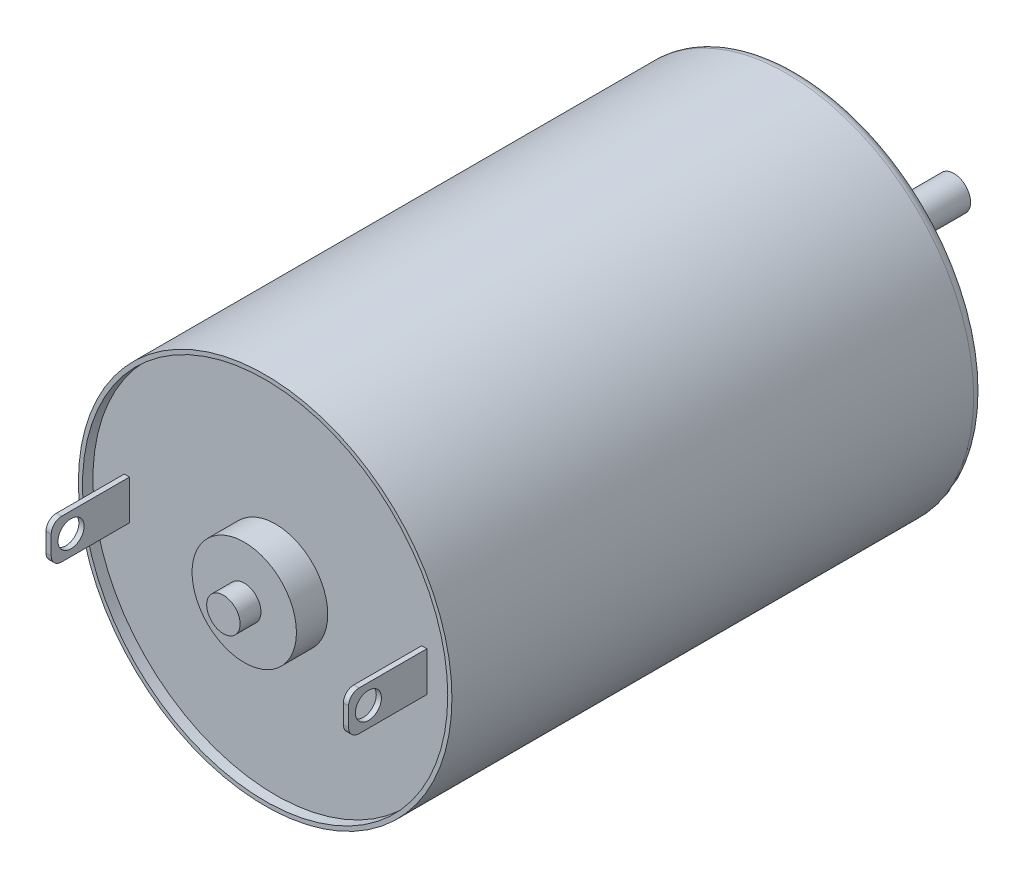
ISO-10303-21;
HEADER;
FILE_DESCRIPTION(('STEP AP214'),'2;1');
FILE_NAME('part.step','',(''),(''),'','','');
FILE_SCHEMA(('AUTOMOTIVE_DESIGN { 1 0 10303 214 1 1 1 1 }'));
ENDSEC;
DATA;
#1=APPLICATION_CONTEXT('core data for automotive mechanical design processes');
#2=APPLICATION_PROTOCOL_DEFINITION('international standard','automotive_design',2000,#1);
#3=PRODUCT_CONTEXT('',#1,'mechanical');
#4=PRODUCT('Part','Part','',(#3));
#5=PRODUCT_RELATED_PRODUCT_CATEGORY('part','',(#4));
#6=PRODUCT_DEFINITION_FORMATION('','',#4);
#7=PRODUCT_DEFINITION_CONTEXT('part definition',#1,'design');
#8=PRODUCT_DEFINITION('design','',#6,#7);
#9=PRODUCT_DEFINITION_SHAPE('','',#8);
#10=(LENGTH_UNIT() NAMED_UNIT(*) SI_UNIT(.MILLI.,.METRE.));
#11=(NAMED_UNIT(*) PLANE_ANGLE_UNIT() SI_UNIT($,.RADIAN.));
#12=(NAMED_UNIT(*) SI_UNIT($,.STERADIAN.) SOLID_ANGLE_UNIT());
#13=UNCERTAINTY_MEASURE_WITH_UNIT(LENGTH_MEASURE(1.E-05),#10,'distance_accuracy_value','');
#14=(GEOMETRIC_REPRESENTATION_CONTEXT(3) GLOBAL_UNCERTAINTY_ASSIGNED_CONTEXT((#13)) GLOBAL_UNIT_ASSIGNED_CONTEXT((#10,
#11,#12)) REPRESENTATION_CONTEXT('',''));
#15=CARTESIAN_POINT('',(0.,0.,0.));
#16=DIRECTION('',(0.,0.,1.));
#17=DIRECTION('',(1.,0.,0.));
#18=AXIS2_PLACEMENT_3D('',#15,#16,#17);
#19=CARTESIAN_POINT('',(0.,0.,50.));
#20=DIRECTION('',(0.,0.,1.));
#21=DIRECTION('',(1.,0.,0.));
#22=AXIS2_PLACEMENT_3D('',#19,#20,#21);
#23=PLANE('',#22);
#24=DIRECTION('',(0.,1.,0.));
#25=VECTOR('',#24,1.);
#26=CARTESIAN_POINT('',(14.,1.9,50.));
#27=LINE('',#26,#25);
#28=CARTESIAN_POINT('',(14.,-1.9,50.));
#29=VERTEX_POINT('',#28);
#30=CARTESIAN_POINT('',(14.,1.9,50.));
#31=VERTEX_POINT('',#30);
#32=EDGE_CURVE('E174',#29,#31,#27,.T.);
#33=ORIENTED_EDGE('',*,*,#32,.T.);
#34=DIRECTION('',(1.,0.,0.));
#35=VECTOR('',#34,1.);
#36=CARTESIAN_POINT('',(14.5,1.9,50.));
#37=LINE('',#36,#35);
#38=CARTESIAN_POINT('',(14.5,1.9,50.));
#39=VERTEX_POINT('',#38);
#40=EDGE_CURVE('E178',#31,#39,#37,.T.);
#41=ORIENTED_EDGE('',*,*,#40,.T.);
#42=DIRECTION('',(0.,-1.,0.));
#43=VECTOR('',#42,1.);
#44=CARTESIAN_POINT('',(14.5,1.9,50.));
#45=LINE('',#44,#43);
#46=CARTESIAN_POINT('',(14.5,-1.9,50.));
#47=VERTEX_POINT('',#46);
#48=EDGE_CURVE('E187',#39,#47,#45,.T.);
#49=ORIENTED_EDGE('',*,*,#48,.T.);
#50=DIRECTION('',(-1.,0.,0.));
#51=VECTOR('',#50,1.);
#52=CARTESIAN_POINT('',(14.5,-1.9,50.));
#53=LINE('',#52,#51);
#54=EDGE_CURVE('E184',#47,#29,#53,.T.);
#55=ORIENTED_EDGE('',*,*,#54,.T.);
#56=EDGE_LOOP('',(#33,#41,#49,#55));
#57=FACE_BOUND('',#56,.T.);
#58=CARTESIAN_POINT('',(0.,0.,50.));
#59=DIRECTION('',(0.,0.,1.));
#60=DIRECTION('',(1.,0.,0.));
#61=AXIS2_PLACEMENT_3D('',#58,#59,#60);
#62=CIRCLE('',#61,5.);
#63=CARTESIAN_POINT('',(5.,0.,50.));
#64=VERTEX_POINT('',#63);
#65=EDGE_CURVE('E252',#64,#64,#62,.T.);
#66=ORIENTED_EDGE('',*,*,#65,.F.);
#67=EDGE_LOOP('',(#66));
#68=FACE_BOUND('',#67,.T.);
#69=CARTESIAN_POINT('',(0.,0.,50.));
#70=DIRECTION('',(0.,0.,1.));
#71=DIRECTION('',(1.,0.,0.));
#72=AXIS2_PLACEMENT_3D('',#69,#70,#71);
#73=CIRCLE('',#72,17.5);
#74=CARTESIAN_POINT('',(17.5,0.,50.));
#75=VERTEX_POINT('',#74);
#76=EDGE_CURVE('E247',#75,#75,#73,.F.);
#77=ORIENTED_EDGE('',*,*,#76,.F.);
#78=EDGE_LOOP('',(#77));
#79=FACE_BOUND('',#78,.T.);
#80=DIRECTION('',(-1.,0.,0.));
#81=VECTOR('',#80,1.);
#82=CARTESIAN_POINT('',(-14.5,1.9,50.));
#83=LINE('',#82,#81);
#84=CARTESIAN_POINT('',(-14.,1.9,50.));
#85=VERTEX_POINT('',#84);
#86=CARTESIAN_POINT('',(-14.5,1.9,50.));
#87=VERTEX_POINT('',#86);
#88=EDGE_CURVE('E216',#85,#87,#83,.T.);
#89=ORIENTED_EDGE('',*,*,#88,.F.);
#90=DIRECTION('',(0.,1.,0.));
#91=VECTOR('',#90,1.);
#92=CARTESIAN_POINT('',(-14.,1.9,50.));
#93=LINE('',#92,#91);
#94=CARTESIAN_POINT('',(-14.,-1.9,50.));
#95=VERTEX_POINT('',#94);
#96=EDGE_CURVE('E205',#95,#85,#93,.T.);
#97=ORIENTED_EDGE('',*,*,#96,.F.);
#98=DIRECTION('',(1.,0.,0.));
#99=VECTOR('',#98,1.);
#100=CARTESIAN_POINT('',(-14.5,-1.9,50.));
#101=LINE('',#100,#99);
#102=CARTESIAN_POINT('',(-14.5,-1.9,50.));
#103=VERTEX_POINT('',#102);
#104=EDGE_CURVE('E210',#103,#95,#101,.T.);
#105=ORIENTED_EDGE('',*,*,#104,.F.);
#106=DIRECTION('',(0.,-1.,0.));
#107=VECTOR('',#106,1.);
#108=CARTESIAN_POINT('',(-14.5,1.9,50.));
#109=LINE('',#108,#107);
#110=EDGE_CURVE('E219',#87,#103,#109,.T.);
#111=ORIENTED_EDGE('',*,*,#110,.F.);
#112=EDGE_LOOP('',(#89,#97,#105,#111));
#113=FACE_BOUND('',#112,.T.);
#114=ADVANCED_FACE('F51',(#57,#68,#79,#113),#23,.T.);
#115=CARTESIAN_POINT('',(0.,0.,50.));
#116=DIRECTION('',(0.,0.,-1.));
#117=DIRECTION('',(-1.,0.,0.));
#118=AXIS2_PLACEMENT_3D('',#115,#116,#117);
#119=CYLINDRICAL_SURFACE('',#118,17.9);
#120=CARTESIAN_POINT('',(0.,0.,1.));
#121=DIRECTION('',(0.,0.,1.));
#122=DIRECTION('',(1.,0.,0.));
#123=AXIS2_PLACEMENT_3D('',#120,#121,#122);
#124=CIRCLE('',#123,17.9);
#125=CARTESIAN_POINT('',(17.9,0.,1.));
#126=VERTEX_POINT('',#125);
#127=EDGE_CURVE('E294',#126,#126,#124,.T.);
#128=ORIENTED_EDGE('',*,*,#127,.T.);
#129=EDGE_LOOP('',(#128));
#130=FACE_BOUND('',#129,.T.);
#131=CARTESIAN_POINT('',(0.,0.,51.));
#132=DIRECTION('',(0.,0.,1.));
#133=DIRECTION('',(1.,0.,0.));
#134=AXIS2_PLACEMENT_3D('',#131,#132,#133);
#135=CIRCLE('',#134,17.9);
#136=CARTESIAN_POINT('',(17.9,0.,51.));
#137=VERTEX_POINT('',#136);
#138=EDGE_CURVE('E234',#137,#137,#135,.T.);
#139=ORIENTED_EDGE('',*,*,#138,.F.);
#140=EDGE_LOOP('',(#139));
#141=FACE_BOUND('',#140,.T.);
#142=ADVANCED_FACE('F319',(#130,#141),#119,.T.);
#143=CARTESIAN_POINT('',(0.,0.,0.));
#144=DIRECTION('',(0.,0.,1.));
#145=DIRECTION('',(1.,0.,0.));
#146=AXIS2_PLACEMENT_3D('',#143,#144,#145);
#147=PLANE('',#146);
#148=CARTESIAN_POINT('',(12.5,0.,0.));
#149=DIRECTION('',(0.,0.,-1.));
#150=DIRECTION('',(-1.,0.,0.));
#151=AXIS2_PLACEMENT_3D('',#148,#149,#150);
#152=CIRCLE('',#151,1.025);
#153=CARTESIAN_POINT('',(11.475,0.,0.));
#154=VERTEX_POINT('',#153);
#155=EDGE_CURVE('E158',#154,#154,#152,.T.);
#156=ORIENTED_EDGE('',*,*,#155,.F.);
#157=EDGE_LOOP('',(#156));
#158=FACE_BOUND('',#157,.T.);
#159=CARTESIAN_POINT('',(-12.5,0.,0.));
#160=DIRECTION('',(0.,0.,-1.));
#161=DIRECTION('',(-1.,0.,0.));
#162=AXIS2_PLACEMENT_3D('',#159,#160,#161);
#163=CIRCLE('',#162,1.025);
#164=CARTESIAN_POINT('',(-13.525,0.,0.));
#165=VERTEX_POINT('',#164);
#166=EDGE_CURVE('E157',#165,#165,#163,.T.);
#167=ORIENTED_EDGE('',*,*,#166,.F.);
#168=EDGE_LOOP('',(#167));
#169=FACE_BOUND('',#168,.T.);
#170=CARTESIAN_POINT('',(0.,0.,0.));
#171=DIRECTION('',(0.,0.,1.));
#172=DIRECTION('',(1.,0.,0.));
#173=AXIS2_PLACEMENT_3D('',#170,#171,#172);
#174=CIRCLE('',#173,16.9);
#175=CARTESIAN_POINT('',(16.9,0.,0.));
#176=VERTEX_POINT('',#175);
#177=EDGE_CURVE('E297',#176,#176,#174,.F.);
#178=ORIENTED_EDGE('',*,*,#177,.T.);
#179=EDGE_LOOP('',(#178));
#180=FACE_BOUND('',#179,.T.);
#181=CARTESIAN_POINT('',(0.,0.,0.));
#182=DIRECTION('',(0.,0.,-1.));
#183=DIRECTION('',(-1.,0.,0.));
#184=AXIS2_PLACEMENT_3D('',#181,#182,#183);
#185=CIRCLE('',#184,6.5);
#186=CARTESIAN_POINT('',(-6.5,0.,0.));
#187=VERTEX_POINT('',#186);
#188=EDGE_CURVE('E251',#187,#187,#185,.T.);
#189=ORIENTED_EDGE('',*,*,#188,.F.);
#190=EDGE_LOOP('',(#189));
#191=FACE_BOUND('',#190,.T.);
#192=ADVANCED_FACE('F325',(#158,#169,#180,#191),#147,.F.);
#193=CARTESIAN_POINT('',(0.,0.,-4.));
#194=DIRECTION('',(0.,0.,1.));
#195=DIRECTION('',(1.,0.,0.));
#196=AXIS2_PLACEMENT_3D('',#193,#194,#195);
#197=CYLINDRICAL_SURFACE('',#196,6.5);
#198=CARTESIAN_POINT('',(0.,0.,-3.));
#199=DIRECTION('',(0.,0.,-1.));
#200=DIRECTION('',(-1.,0.,0.));
#201=AXIS2_PLACEMENT_3D('',#198,#199,#200);
#202=CIRCLE('',#201,6.5);
#203=CARTESIAN_POINT('',(-6.5,0.,-3.));
#204=VERTEX_POINT('',#203);
#205=EDGE_CURVE('E12',#204,#204,#202,.F.);
#206=ORIENTED_EDGE('',*,*,#205,.T.);
#207=EDGE_LOOP('',(#206));
#208=FACE_BOUND('',#207,.T.);
#209=ORIENTED_EDGE('',*,*,#188,.T.);
#210=EDGE_LOOP('',(#209));
#211=FACE_BOUND('',#210,.T.);
#212=ADVANCED_FACE('F331',(#208,#211),#197,.T.);
#213=CARTESIAN_POINT('',(0.,0.,-4.));
#214=DIRECTION('',(0.,0.,-1.));
#215=DIRECTION('',(-1.,0.,0.));
#216=AXIS2_PLACEMENT_3D('',#213,#214,#215);
#217=PLANE('',#216);
#218=CARTESIAN_POINT('',(0.,0.,-4.));
#219=DIRECTION('',(0.,0.,-1.));
#220=DIRECTION('',(-1.,0.,0.));
#221=AXIS2_PLACEMENT_3D('',#218,#219,#220);
#222=CIRCLE('',#221,5.5);
#223=CARTESIAN_POINT('',(-5.5,0.,-4.));
#224=VERTEX_POINT('',#223);
#225=EDGE_CURVE('E59',#224,#224,#222,.T.);
#226=ORIENTED_EDGE('',*,*,#225,.T.);
#227=EDGE_LOOP('',(#226));
#228=FACE_BOUND('',#227,.T.);
#229=CARTESIAN_POINT('',(0.,0.,-4.));
#230=DIRECTION('',(0.,0.,-1.));
#231=DIRECTION('',(-1.,0.,0.));
#232=AXIS2_PLACEMENT_3D('',#229,#230,#231);
#233=CIRCLE('',#232,1.6);
#234=CARTESIAN_POINT('',(-1.6,0.,-4.));
#235=VERTEX_POINT('',#234);
#236=EDGE_CURVE('E244',#235,#235,#233,.T.);
#237=ORIENTED_EDGE('',*,*,#236,.F.);
#238=EDGE_LOOP('',(#237));
#239=FACE_BOUND('',#238,.T.);
#240=ADVANCED_FACE('F302',(#228,#239),#217,.T.);
#241=CARTESIAN_POINT('',(0.,0.,61.5254833995939));
#242=DIRECTION('',(0.,0.,-1.));
#243=DIRECTION('',(-1.,0.,0.));
#244=AXIS2_PLACEMENT_3D('',#241,#242,#243);
#245=CYLINDRICAL_SURFACE('',#244,1.6);
#246=ORIENTED_EDGE('',*,*,#236,.T.);
#247=EDGE_LOOP('',(#246));
#248=FACE_BOUND('',#247,.T.);
#249=CARTESIAN_POINT('',(0.,0.,-15.));
#250=DIRECTION('',(0.,0.,-1.));
#251=DIRECTION('',(-1.,0.,0.));
#252=AXIS2_PLACEMENT_3D('',#249,#250,#251);
#253=CIRCLE('',#252,1.6);
#254=CARTESIAN_POINT('',(-1.6,0.,-15.));
#255=VERTEX_POINT('',#254);
#256=EDGE_CURVE('E237',#255,#255,#253,.T.);
#257=ORIENTED_EDGE('',*,*,#256,.F.);
#258=EDGE_LOOP('',(#257));
#259=FACE_BOUND('',#258,.T.);
#260=ADVANCED_FACE('F427',(#248,#259),#245,.T.);
#261=CARTESIAN_POINT('',(0.,0.,-15.));
#262=DIRECTION('',(0.,0.,-1.));
#263=DIRECTION('',(-1.,0.,0.));
#264=AXIS2_PLACEMENT_3D('',#261,#262,#263);
#265=PLANE('',#264);
#266=ORIENTED_EDGE('',*,*,#256,.T.);
#267=EDGE_LOOP('',(#266));
#268=FACE_BOUND('',#267,.T.);
#269=ADVANCED_FACE('F423',(#268),#265,.T.);
#270=CARTESIAN_POINT('',(0.,0.,51.));
#271=DIRECTION('',(0.,0.,1.));
#272=DIRECTION('',(1.,0.,0.));
#273=AXIS2_PLACEMENT_3D('',#270,#271,#272);
#274=PLANE('',#273);
#275=ORIENTED_EDGE('',*,*,#138,.T.);
#276=EDGE_LOOP('',(#275));
#277=FACE_BOUND('',#276,.T.);
#278=CARTESIAN_POINT('',(0.,0.,51.));
#279=DIRECTION('',(0.,0.,1.));
#280=DIRECTION('',(1.,0.,0.));
#281=AXIS2_PLACEMENT_3D('',#278,#279,#280);
#282=CIRCLE('',#281,17.5);
#283=CARTESIAN_POINT('',(17.5,0.,51.));
#284=VERTEX_POINT('',#283);
#285=EDGE_CURVE('E231',#284,#284,#282,.T.);
#286=ORIENTED_EDGE('',*,*,#285,.F.);
#287=EDGE_LOOP('',(#286));
#288=FACE_BOUND('',#287,.T.);
#289=ADVANCED_FACE('F419',(#277,#288),#274,.T.);
#290=CARTESIAN_POINT('',(0.,0.,51.));
#291=DIRECTION('',(0.,0.,-1.));
#292=DIRECTION('',(-1.,0.,0.));
#293=AXIS2_PLACEMENT_3D('',#290,#291,#292);
#294=CYLINDRICAL_SURFACE('',#293,17.5);
#295=ORIENTED_EDGE('',*,*,#285,.T.);
#296=EDGE_LOOP('',(#295));
#297=FACE_BOUND('',#296,.T.);
#298=ORIENTED_EDGE('',*,*,#76,.T.);
#299=EDGE_LOOP('',(#298));
#300=FACE_BOUND('',#299,.T.);
#301=ADVANCED_FACE('F415',(#297,#300),#294,.F.);
#302=CARTESIAN_POINT('',(0.,0.,55.));
#303=DIRECTION('',(0.,0.,1.));
#304=DIRECTION('',(1.,0.,0.));
#305=AXIS2_PLACEMENT_3D('',#302,#303,#304);
#306=PLANE('',#305);
#307=CARTESIAN_POINT('',(0.,0.,55.));
#308=DIRECTION('',(0.,0.,1.));
#309=DIRECTION('',(1.,0.,0.));
#310=AXIS2_PLACEMENT_3D('',#307,#308,#309);
#311=CIRCLE('',#310,1.6);
#312=CARTESIAN_POINT('',(1.6,0.,55.));
#313=VERTEX_POINT('',#312);
#314=EDGE_CURVE('E240',#313,#313,#311,.F.);
#315=ORIENTED_EDGE('',*,*,#314,.F.);
#316=EDGE_LOOP('',(#315));
#317=FACE_BOUND('',#316,.T.);
#318=ADVANCED_FACE('F418',(#317),#306,.T.);
#319=CARTESIAN_POINT('',(0.,0.,53.));
#320=DIRECTION('',(0.,0.,1.));
#321=DIRECTION('',(1.,0.,0.));
#322=AXIS2_PLACEMENT_3D('',#319,#320,#321);
#323=CIRCLE('',#322,1.6);
#324=CARTESIAN_POINT('',(1.6,0.,53.));
#325=VERTEX_POINT('',#324);
#326=EDGE_CURVE('E248',#325,#325,#323,.T.);
#327=ORIENTED_EDGE('',*,*,#326,.T.);
#328=EDGE_LOOP('',(#327));
#329=FACE_BOUND('',#328,.T.);
#330=ORIENTED_EDGE('',*,*,#314,.T.);
#331=EDGE_LOOP('',(#330));
#332=FACE_BOUND('',#331,.T.);
#333=ADVANCED_FACE('F429',(#329,#332),#245,.T.);
#334=CARTESIAN_POINT('',(0.,0.,53.));
#335=DIRECTION('',(0.,0.,1.));
#336=DIRECTION('',(1.,0.,0.));
#337=AXIS2_PLACEMENT_3D('',#334,#335,#336);
#338=PLANE('',#337);
#339=ORIENTED_EDGE('',*,*,#326,.F.);
#340=EDGE_LOOP('',(#339));
#341=FACE_BOUND('',#340,.T.);
#342=CARTESIAN_POINT('',(0.,0.,53.));
#343=DIRECTION('',(0.,0.,1.));
#344=DIRECTION('',(1.,0.,0.));
#345=AXIS2_PLACEMENT_3D('',#342,#343,#344);
#346=CIRCLE('',#345,5.);
#347=CARTESIAN_POINT('',(5.,0.,53.));
#348=VERTEX_POINT('',#347);
#349=EDGE_CURVE('E243',#348,#348,#346,.T.);
#350=ORIENTED_EDGE('',*,*,#349,.T.);
#351=EDGE_LOOP('',(#350));
#352=FACE_BOUND('',#351,.T.);
#353=ADVANCED_FACE('F432',(#341,#352),#338,.T.);
#354=CARTESIAN_POINT('',(0.,0.,53.));
#355=DIRECTION('',(0.,0.,-1.));
#356=DIRECTION('',(-1.,0.,0.));
#357=AXIS2_PLACEMENT_3D('',#354,#355,#356);
#358=CYLINDRICAL_SURFACE('',#357,5.);
#359=ORIENTED_EDGE('',*,*,#349,.F.);
#360=EDGE_LOOP('',(#359));
#361=FACE_BOUND('',#360,.T.);
#362=ORIENTED_EDGE('',*,*,#65,.T.);
#363=EDGE_LOOP('',(#362));
#364=FACE_BOUND('',#363,.T.);
#365=ADVANCED_FACE('F413',(#361,#364),#358,.T.);
#366=CARTESIAN_POINT('',(-14.,1.9,57.5));
#367=DIRECTION('',(-1.,0.,0.));
#368=DIRECTION('',(0.,0.,1.));
#369=AXIS2_PLACEMENT_3D('',#366,#367,#368);
#370=PLANE('',#369);
#371=CARTESIAN_POINT('',(-14.,0.,55.6));
#372=DIRECTION('',(-1.,0.,0.));
#373=DIRECTION('',(0.,0.,1.));
#374=AXIS2_PLACEMENT_3D('',#371,#372,#373);
#375=CIRCLE('',#374,1.25);
#376=CARTESIAN_POINT('',(-14.,0.,56.85));
#377=VERTEX_POINT('',#376);
#378=EDGE_CURVE('E202',#377,#377,#375,.F.);
#379=ORIENTED_EDGE('',*,*,#378,.F.);
#380=EDGE_LOOP('',(#379));
#381=FACE_BOUND('',#380,.T.);
#382=DIRECTION('',(0.,0.,-1.));
#383=VECTOR('',#382,1.);
#384=CARTESIAN_POINT('',(-14.,1.9,57.5));
#385=LINE('',#384,#383);
#386=CARTESIAN_POINT('',(-14.,1.9,56.5));
#387=VERTEX_POINT('',#386);
#388=EDGE_CURVE('E229',#387,#85,#385,.T.);
#389=ORIENTED_EDGE('',*,*,#388,.F.);
#390=CARTESIAN_POINT('',(-14.,0.9,56.5));
#391=DIRECTION('',(-1.,0.,0.));
#392=DIRECTION('',(0.,0.,1.));
#393=AXIS2_PLACEMENT_3D('',#390,#391,#392);
#394=CIRCLE('',#393,1.);
#395=CARTESIAN_POINT('',(-14.,0.9,57.5));
#396=VERTEX_POINT('',#395);
#397=EDGE_CURVE('E275',#387,#396,#394,.F.);
#398=ORIENTED_EDGE('',*,*,#397,.T.);
#399=DIRECTION('',(0.,1.,0.));
#400=VECTOR('',#399,1.);
#401=CARTESIAN_POINT('',(-14.,1.9,57.5));
#402=LINE('',#401,#400);
#403=CARTESIAN_POINT('',(-14.,-0.899999999999999,57.5));
#404=VERTEX_POINT('',#403);
#405=EDGE_CURVE('E206',#404,#396,#402,.T.);
#406=ORIENTED_EDGE('',*,*,#405,.F.);
#407=CARTESIAN_POINT('',(-14.,-0.9,56.5));
#408=DIRECTION('',(-1.,0.,0.));
#409=DIRECTION('',(0.,0.,1.));
#410=AXIS2_PLACEMENT_3D('',#407,#408,#409);
#411=CIRCLE('',#410,1.);
#412=CARTESIAN_POINT('',(-14.,-1.9,56.5));
#413=VERTEX_POINT('',#412);
#414=EDGE_CURVE('E273',#404,#413,#411,.F.);
#415=ORIENTED_EDGE('',*,*,#414,.T.);
#416=DIRECTION('',(0.,0.,-1.));
#417=VECTOR('',#416,1.);
#418=CARTESIAN_POINT('',(-14.,-1.9,57.5));
#419=LINE('',#418,#417);
#420=EDGE_CURVE('E213',#413,#95,#419,.T.);
#421=ORIENTED_EDGE('',*,*,#420,.T.);
#422=ORIENTED_EDGE('',*,*,#96,.T.);
#423=EDGE_LOOP('',(#389,#398,#406,#415,#421,#422));
#424=FACE_BOUND('',#423,.T.);
#425=ADVANCED_FACE('F409',(#381,#424),#370,.F.);
#426=CARTESIAN_POINT('',(-14.5,1.9,57.5));
#427=DIRECTION('',(0.,-1.,0.));
#428=DIRECTION('',(0.,0.,-1.));
#429=AXIS2_PLACEMENT_3D('',#426,#427,#428);
#430=PLANE('',#429);
#431=DIRECTION('',(0.,0.,-1.));
#432=VECTOR('',#431,1.);
#433=CARTESIAN_POINT('',(-14.5,1.9,57.5));
#434=LINE('',#433,#432);
#435=CARTESIAN_POINT('',(-14.5,1.9,56.5));
#436=VERTEX_POINT('',#435);
#437=EDGE_CURVE('E227',#436,#87,#434,.T.);
#438=ORIENTED_EDGE('',*,*,#437,.F.);
#439=DIRECTION('',(-1.,0.,0.));
#440=VECTOR('',#439,1.);
#441=CARTESIAN_POINT('',(-14.,1.9,56.5));
#442=LINE('',#441,#440);
#443=EDGE_CURVE('E271',#436,#387,#442,.F.);
#444=ORIENTED_EDGE('',*,*,#443,.T.);
#445=ORIENTED_EDGE('',*,*,#388,.T.);
#446=ORIENTED_EDGE('',*,*,#88,.T.);
#447=EDGE_LOOP('',(#438,#444,#445,#446));
#448=FACE_BOUND('',#447,.T.);
#449=ADVANCED_FACE('F405',(#448),#430,.F.);
#450=CARTESIAN_POINT('',(-14.5,1.9,57.5));
#451=DIRECTION('',(1.,0.,0.));
#452=DIRECTION('',(0.,0.,-1.));
#453=AXIS2_PLACEMENT_3D('',#450,#451,#452);
#454=PLANE('',#453);
#455=CARTESIAN_POINT('',(-14.5,0.,55.6));
#456=DIRECTION('',(-1.,0.,0.));
#457=DIRECTION('',(0.,0.,1.));
#458=AXIS2_PLACEMENT_3D('',#455,#456,#457);
#459=CIRCLE('',#458,1.25);
#460=CARTESIAN_POINT('',(-14.5,0.,56.85));
#461=VERTEX_POINT('',#460);
#462=EDGE_CURVE('E199',#461,#461,#459,.T.);
#463=ORIENTED_EDGE('',*,*,#462,.F.);
#464=EDGE_LOOP('',(#463));
#465=FACE_BOUND('',#464,.T.);
#466=DIRECTION('',(0.,-1.,0.));
#467=VECTOR('',#466,1.);
#468=CARTESIAN_POINT('',(-14.5,1.9,57.5));
#469=LINE('',#468,#467);
#470=CARTESIAN_POINT('',(-14.5,0.9,57.5));
#471=VERTEX_POINT('',#470);
#472=CARTESIAN_POINT('',(-14.5,-0.899999999999999,57.5));
#473=VERTEX_POINT('',#472);
#474=EDGE_CURVE('E209',#471,#473,#469,.T.);
#475=ORIENTED_EDGE('',*,*,#474,.F.);
#476=CARTESIAN_POINT('',(-14.5,0.9,56.5));
#477=DIRECTION('',(1.,0.,0.));
#478=DIRECTION('',(0.,0.,-1.));
#479=AXIS2_PLACEMENT_3D('',#476,#477,#478);
#480=CIRCLE('',#479,1.);
#481=EDGE_CURVE('E269',#471,#436,#480,.F.);
#482=ORIENTED_EDGE('',*,*,#481,.T.);
#483=ORIENTED_EDGE('',*,*,#437,.T.);
#484=ORIENTED_EDGE('',*,*,#110,.T.);
#485=DIRECTION('',(0.,0.,-1.));
#486=VECTOR('',#485,1.);
#487=CARTESIAN_POINT('',(-14.5,-1.9,57.5));
#488=LINE('',#487,#486);
#489=CARTESIAN_POINT('',(-14.5,-1.9,56.5));
#490=VERTEX_POINT('',#489);
#491=EDGE_CURVE('E225',#490,#103,#488,.T.);
#492=ORIENTED_EDGE('',*,*,#491,.F.);
#493=CARTESIAN_POINT('',(-14.5,-0.9,56.5));
#494=DIRECTION('',(1.,0.,0.));
#495=DIRECTION('',(0.,0.,-1.));
#496=AXIS2_PLACEMENT_3D('',#493,#494,#495);
#497=CIRCLE('',#496,1.);
#498=EDGE_CURVE('E267',#490,#473,#497,.F.);
#499=ORIENTED_EDGE('',*,*,#498,.T.);
#500=EDGE_LOOP('',(#475,#482,#483,#484,#492,#499));
#501=FACE_BOUND('',#500,.T.);
#502=ADVANCED_FACE('F401',(#465,#501),#454,.F.);
#503=CARTESIAN_POINT('',(-14.5,-1.9,57.5));
#504=DIRECTION('',(0.,1.,0.));
#505=DIRECTION('',(0.,0.,1.));
#506=AXIS2_PLACEMENT_3D('',#503,#504,#505);
#507=PLANE('',#506);
#508=ORIENTED_EDGE('',*,*,#420,.F.);
#509=DIRECTION('',(1.,0.,0.));
#510=VECTOR('',#509,1.);
#511=CARTESIAN_POINT('',(-14.5,-1.9,56.5));
#512=LINE('',#511,#510);
#513=EDGE_CURVE('E277',#413,#490,#512,.F.);
#514=ORIENTED_EDGE('',*,*,#513,.T.);
#515=ORIENTED_EDGE('',*,*,#491,.T.);
#516=ORIENTED_EDGE('',*,*,#104,.T.);
#517=EDGE_LOOP('',(#508,#514,#515,#516));
#518=FACE_BOUND('',#517,.T.);
#519=ADVANCED_FACE('F397',(#518),#507,.F.);
#520=CARTESIAN_POINT('',(0.,0.,57.5));
#521=DIRECTION('',(0.,0.,1.));
#522=DIRECTION('',(1.,0.,0.));
#523=AXIS2_PLACEMENT_3D('',#520,#521,#522);
#524=PLANE('',#523);
#525=ORIENTED_EDGE('',*,*,#405,.T.);
#526=DIRECTION('',(-1.,0.,0.));
#527=VECTOR('',#526,1.);
#528=CARTESIAN_POINT('',(-14.5,0.9,57.5));
#529=LINE('',#528,#527);
#530=EDGE_CURVE('E264',#396,#471,#529,.T.);
#531=ORIENTED_EDGE('',*,*,#530,.T.);
#532=ORIENTED_EDGE('',*,*,#474,.T.);
#533=DIRECTION('',(1.,0.,0.));
#534=VECTOR('',#533,1.);
#535=CARTESIAN_POINT('',(-14.,-0.9,57.5));
#536=LINE('',#535,#534);
#537=EDGE_CURVE('E261',#473,#404,#536,.T.);
#538=ORIENTED_EDGE('',*,*,#537,.T.);
#539=EDGE_LOOP('',(#525,#531,#532,#538));
#540=FACE_BOUND('',#539,.T.);
#541=ADVANCED_FACE('F393',(#540),#524,.T.);
#542=CARTESIAN_POINT('',(-10.4644660940673,0.,55.6));
#543=DIRECTION('',(-1.,0.,0.));
#544=DIRECTION('',(0.,0.,1.));
#545=AXIS2_PLACEMENT_3D('',#542,#543,#544);
#546=CYLINDRICAL_SURFACE('',#545,1.25);
#547=ORIENTED_EDGE('',*,*,#378,.T.);
#548=EDGE_LOOP('',(#547));
#549=FACE_BOUND('',#548,.T.);
#550=ORIENTED_EDGE('',*,*,#462,.T.);
#551=EDGE_LOOP('',(#550));
#552=FACE_BOUND('',#551,.T.);
#553=ADVANCED_FACE('F340',(#549,#552),#546,.F.);
#554=CARTESIAN_POINT('',(0.,0.9,56.5));
#555=DIRECTION('',(1.,0.,0.));
#556=DIRECTION('',(0.,0.,-1.));
#557=AXIS2_PLACEMENT_3D('',#554,#555,#556);
#558=CYLINDRICAL_SURFACE('',#557,1.);
#559=ORIENTED_EDGE('',*,*,#397,.F.);
#560=ORIENTED_EDGE('',*,*,#443,.F.);
#561=ORIENTED_EDGE('',*,*,#481,.F.);
#562=ORIENTED_EDGE('',*,*,#530,.F.);
#563=EDGE_LOOP('',(#559,#560,#561,#562));
#564=FACE_BOUND('',#563,.T.);
#565=ADVANCED_FACE('F336',(#564),#558,.T.);
#566=CARTESIAN_POINT('',(0.,-0.9,56.5));
#567=DIRECTION('',(-1.,0.,0.));
#568=DIRECTION('',(0.,0.,1.));
#569=AXIS2_PLACEMENT_3D('',#566,#567,#568);
#570=CYLINDRICAL_SURFACE('',#569,1.);
#571=ORIENTED_EDGE('',*,*,#498,.F.);
#572=ORIENTED_EDGE('',*,*,#513,.F.);
#573=ORIENTED_EDGE('',*,*,#414,.F.);
#574=ORIENTED_EDGE('',*,*,#537,.F.);
#575=EDGE_LOOP('',(#571,#572,#573,#574));
#576=FACE_BOUND('',#575,.T.);
#577=ADVANCED_FACE('F339',(#576),#570,.T.);
#578=CARTESIAN_POINT('',(14.,1.9,57.5));
#579=DIRECTION('',(-1.,0.,0.));
#580=DIRECTION('',(0.,0.,1.));
#581=AXIS2_PLACEMENT_3D('',#578,#579,#580);
#582=PLANE('',#581);
#583=CARTESIAN_POINT('',(14.,0.,55.6));
#584=DIRECTION('',(1.,0.,0.));
#585=DIRECTION('',(0.,0.,-1.));
#586=AXIS2_PLACEMENT_3D('',#583,#584,#585);
#587=CIRCLE('',#586,1.25);
#588=CARTESIAN_POINT('',(14.,0.,54.35));
#589=VERTEX_POINT('',#588);
#590=EDGE_CURVE('E171',#589,#589,#587,.T.);
#591=ORIENTED_EDGE('',*,*,#590,.T.);
#592=EDGE_LOOP('',(#591));
#593=FACE_BOUND('',#592,.T.);
#594=DIRECTION('',(0.,1.,0.));
#595=VECTOR('',#594,1.);
#596=CARTESIAN_POINT('',(14.,1.9,57.5));
#597=LINE('',#596,#595);
#598=CARTESIAN_POINT('',(14.,-0.899999999999999,57.5));
#599=VERTEX_POINT('',#598);
#600=CARTESIAN_POINT('',(14.,0.9,57.5));
#601=VERTEX_POINT('',#600);
#602=EDGE_CURVE('E175',#599,#601,#597,.T.);
#603=ORIENTED_EDGE('',*,*,#602,.T.);
#604=CARTESIAN_POINT('',(14.,0.9,56.5));
#605=DIRECTION('',(-1.,0.,0.));
#606=DIRECTION('',(0.,0.,1.));
#607=AXIS2_PLACEMENT_3D('',#604,#605,#606);
#608=CIRCLE('',#607,1.);
#609=CARTESIAN_POINT('',(14.,1.9,56.5));
#610=VERTEX_POINT('',#609);
#611=EDGE_CURVE('E290',#601,#610,#608,.T.);
#612=ORIENTED_EDGE('',*,*,#611,.T.);
#613=DIRECTION('',(0.,0.,-1.));
#614=VECTOR('',#613,1.);
#615=CARTESIAN_POINT('',(14.,1.9,57.5));
#616=LINE('',#615,#614);
#617=EDGE_CURVE('E181',#610,#31,#616,.T.);
#618=ORIENTED_EDGE('',*,*,#617,.T.);
#619=ORIENTED_EDGE('',*,*,#32,.F.);
#620=DIRECTION('',(0.,0.,-1.));
#621=VECTOR('',#620,1.);
#622=CARTESIAN_POINT('',(14.,-1.9,57.5));
#623=LINE('',#622,#621);
#624=CARTESIAN_POINT('',(14.,-1.9,56.5));
#625=VERTEX_POINT('',#624);
#626=EDGE_CURVE('E197',#625,#29,#623,.T.);
#627=ORIENTED_EDGE('',*,*,#626,.F.);
#628=CARTESIAN_POINT('',(14.,-0.9,56.5));
#629=DIRECTION('',(-1.,0.,0.));
#630=DIRECTION('',(0.,0.,1.));
#631=AXIS2_PLACEMENT_3D('',#628,#629,#630);
#632=CIRCLE('',#631,1.);
#633=EDGE_CURVE('E66',#625,#599,#632,.T.);
#634=ORIENTED_EDGE('',*,*,#633,.T.);
#635=EDGE_LOOP('',(#603,#612,#618,#619,#627,#634));
#636=FACE_BOUND('',#635,.T.);
#637=ADVANCED_FACE('F344',(#593,#636),#582,.T.);
#638=CARTESIAN_POINT('',(14.5,-1.9,57.5));
#639=DIRECTION('',(0.,-1.,0.));
#640=DIRECTION('',(0.,0.,-1.));
#641=AXIS2_PLACEMENT_3D('',#638,#639,#640);
#642=PLANE('',#641);
#643=DIRECTION('',(0.,0.,-1.));
#644=VECTOR('',#643,1.);
#645=CARTESIAN_POINT('',(14.5,-1.9,57.5));
#646=LINE('',#645,#644);
#647=CARTESIAN_POINT('',(14.5,-1.9,56.5));
#648=VERTEX_POINT('',#647);
#649=EDGE_CURVE('E195',#648,#47,#646,.T.);
#650=ORIENTED_EDGE('',*,*,#649,.F.);
#651=DIRECTION('',(-1.,0.,0.));
#652=VECTOR('',#651,1.);
#653=CARTESIAN_POINT('',(14.5,-1.9,56.5));
#654=LINE('',#653,#652);
#655=EDGE_CURVE('E292',#648,#625,#654,.T.);
#656=ORIENTED_EDGE('',*,*,#655,.T.);
#657=ORIENTED_EDGE('',*,*,#626,.T.);
#658=ORIENTED_EDGE('',*,*,#54,.F.);
#659=EDGE_LOOP('',(#650,#656,#657,#658));
#660=FACE_BOUND('',#659,.T.);
#661=ADVANCED_FACE('F362',(#660),#642,.T.);
#662=CARTESIAN_POINT('',(14.5,1.9,57.5));
#663=DIRECTION('',(1.,0.,0.));
#664=DIRECTION('',(0.,0.,-1.));
#665=AXIS2_PLACEMENT_3D('',#662,#663,#664);
#666=PLANE('',#665);
#667=CARTESIAN_POINT('',(14.5,0.,55.6));
#668=DIRECTION('',(-1.,0.,0.));
#669=DIRECTION('',(0.,0.,1.));
#670=AXIS2_PLACEMENT_3D('',#667,#668,#669);
#671=CIRCLE('',#670,1.25);
#672=CARTESIAN_POINT('',(14.5,0.,56.85));
#673=VERTEX_POINT('',#672);
#674=EDGE_CURVE('E168',#673,#673,#671,.T.);
#675=ORIENTED_EDGE('',*,*,#674,.T.);
#676=EDGE_LOOP('',(#675));
#677=FACE_BOUND('',#676,.T.);
#678=DIRECTION('',(0.,0.,-1.));
#679=VECTOR('',#678,1.);
#680=CARTESIAN_POINT('',(14.5,1.9,57.5));
#681=LINE('',#680,#679);
#682=CARTESIAN_POINT('',(14.5,1.9,56.5));
#683=VERTEX_POINT('',#682);
#684=EDGE_CURVE('E193',#683,#39,#681,.T.);
#685=ORIENTED_EDGE('',*,*,#684,.F.);
#686=CARTESIAN_POINT('',(14.5,0.9,56.5));
#687=DIRECTION('',(1.,0.,0.));
#688=DIRECTION('',(0.,0.,-1.));
#689=AXIS2_PLACEMENT_3D('',#686,#687,#688);
#690=CIRCLE('',#689,1.);
#691=CARTESIAN_POINT('',(14.5,0.9,57.5));
#692=VERTEX_POINT('',#691);
#693=EDGE_CURVE('E284',#683,#692,#690,.T.);
#694=ORIENTED_EDGE('',*,*,#693,.T.);
#695=DIRECTION('',(0.,-1.,0.));
#696=VECTOR('',#695,1.);
#697=CARTESIAN_POINT('',(14.5,1.9,57.5));
#698=LINE('',#697,#696);
#699=CARTESIAN_POINT('',(14.5,-0.899999999999999,57.5));
#700=VERTEX_POINT('',#699);
#701=EDGE_CURVE('E177',#692,#700,#698,.T.);
#702=ORIENTED_EDGE('',*,*,#701,.T.);
#703=CARTESIAN_POINT('',(14.5,-0.9,56.5));
#704=DIRECTION('',(1.,0.,0.));
#705=DIRECTION('',(0.,0.,-1.));
#706=AXIS2_PLACEMENT_3D('',#703,#704,#705);
#707=CIRCLE('',#706,1.);
#708=EDGE_CURVE('E282',#700,#648,#707,.T.);
#709=ORIENTED_EDGE('',*,*,#708,.T.);
#710=ORIENTED_EDGE('',*,*,#649,.T.);
#711=ORIENTED_EDGE('',*,*,#48,.F.);
#712=EDGE_LOOP('',(#685,#694,#702,#709,#710,#711));
#713=FACE_BOUND('',#712,.T.);
#714=ADVANCED_FACE('F358',(#677,#713),#666,.T.);
#715=CARTESIAN_POINT('',(14.5,1.9,57.5));
#716=DIRECTION('',(0.,1.,0.));
#717=DIRECTION('',(0.,0.,1.));
#718=AXIS2_PLACEMENT_3D('',#715,#716,#717);
#719=PLANE('',#718);
#720=ORIENTED_EDGE('',*,*,#617,.F.);
#721=DIRECTION('',(1.,0.,0.));
#722=VECTOR('',#721,1.);
#723=CARTESIAN_POINT('',(14.5,1.9,56.5));
#724=LINE('',#723,#722);
#725=EDGE_CURVE('E279',#610,#683,#724,.T.);
#726=ORIENTED_EDGE('',*,*,#725,.T.);
#727=ORIENTED_EDGE('',*,*,#684,.T.);
#728=ORIENTED_EDGE('',*,*,#40,.F.);
#729=EDGE_LOOP('',(#720,#726,#727,#728));
#730=FACE_BOUND('',#729,.T.);
#731=ADVANCED_FACE('F371',(#730),#719,.T.);
#732=CARTESIAN_POINT('',(0.,0.,57.5));
#733=DIRECTION('',(0.,0.,1.));
#734=DIRECTION('',(-1.,0.,0.));
#735=AXIS2_PLACEMENT_3D('',#732,#733,#734);
#736=PLANE('',#735);
#737=ORIENTED_EDGE('',*,*,#701,.F.);
#738=DIRECTION('',(1.,0.,0.));
#739=VECTOR('',#738,1.);
#740=CARTESIAN_POINT('',(0.,0.9,57.5));
#741=LINE('',#740,#739);
#742=EDGE_CURVE('E74',#692,#601,#741,.F.);
#743=ORIENTED_EDGE('',*,*,#742,.T.);
#744=ORIENTED_EDGE('',*,*,#602,.F.);
#745=DIRECTION('',(-1.,0.,0.));
#746=VECTOR('',#745,1.);
#747=CARTESIAN_POINT('',(0.,-0.9,57.5));
#748=LINE('',#747,#746);
#749=EDGE_CURVE('E286',#599,#700,#748,.F.);
#750=ORIENTED_EDGE('',*,*,#749,.T.);
#751=EDGE_LOOP('',(#737,#743,#744,#750));
#752=FACE_BOUND('',#751,.T.);
#753=ADVANCED_FACE('F372',(#752),#736,.T.);
#754=CARTESIAN_POINT('',(-17.5355339059327,0.,55.6));
#755=DIRECTION('',(1.,0.,0.));
#756=DIRECTION('',(0.,0.,-1.));
#757=AXIS2_PLACEMENT_3D('',#754,#755,#756);
#758=CYLINDRICAL_SURFACE('',#757,1.25);
#759=ORIENTED_EDGE('',*,*,#590,.F.);
#760=EDGE_LOOP('',(#759));
#761=FACE_BOUND('',#760,.T.);
#762=ORIENTED_EDGE('',*,*,#674,.F.);
#763=EDGE_LOOP('',(#762));
#764=FACE_BOUND('',#763,.T.);
#765=ADVANCED_FACE('F349',(#761,#764),#758,.F.);
#766=CARTESIAN_POINT('',(14.5,0.9,56.5));
#767=DIRECTION('',(1.,0.,0.));
#768=DIRECTION('',(0.,0.,-1.));
#769=AXIS2_PLACEMENT_3D('',#766,#767,#768);
#770=CYLINDRICAL_SURFACE('',#769,1.);
#771=ORIENTED_EDGE('',*,*,#611,.F.);
#772=ORIENTED_EDGE('',*,*,#742,.F.);
#773=ORIENTED_EDGE('',*,*,#693,.F.);
#774=ORIENTED_EDGE('',*,*,#725,.F.);
#775=EDGE_LOOP('',(#771,#772,#773,#774));
#776=FACE_BOUND('',#775,.T.);
#777=ADVANCED_FACE('F346',(#776),#770,.T.);
#778=CARTESIAN_POINT('',(14.5,-0.9,56.5));
#779=DIRECTION('',(-1.,0.,0.));
#780=DIRECTION('',(0.,0.,1.));
#781=AXIS2_PLACEMENT_3D('',#778,#779,#780);
#782=CYLINDRICAL_SURFACE('',#781,1.);
#783=ORIENTED_EDGE('',*,*,#708,.F.);
#784=ORIENTED_EDGE('',*,*,#749,.F.);
#785=ORIENTED_EDGE('',*,*,#633,.F.);
#786=ORIENTED_EDGE('',*,*,#655,.F.);
#787=EDGE_LOOP('',(#783,#784,#785,#786));
#788=FACE_BOUND('',#787,.T.);
#789=ADVANCED_FACE('F315',(#788),#782,.T.);
#790=CARTESIAN_POINT('',(0.,0.,1.));
#791=DIRECTION('',(0.,0.,1.));
#792=DIRECTION('',(1.,0.,0.));
#793=AXIS2_PLACEMENT_3D('',#790,#791,#792);
#794=TOROIDAL_SURFACE('',#793,16.9,1.);
#795=ORIENTED_EDGE('',*,*,#177,.F.);
#796=EDGE_LOOP('',(#795));
#797=FACE_BOUND('',#796,.T.);
#798=ORIENTED_EDGE('',*,*,#127,.F.);
#799=EDGE_LOOP('',(#798));
#800=FACE_BOUND('',#799,.T.);
#801=ADVANCED_FACE('F307',(#797,#800),#794,.T.);
#802=CARTESIAN_POINT('',(0.,0.,-3.));
#803=DIRECTION('',(0.,0.,-1.));
#804=DIRECTION('',(-1.,0.,0.));
#805=AXIS2_PLACEMENT_3D('',#802,#803,#804);
#806=TOROIDAL_SURFACE('',#805,5.5,1.);
#807=ORIENTED_EDGE('',*,*,#205,.F.);
#808=EDGE_LOOP('',(#807));
#809=FACE_BOUND('',#808,.T.);
#810=ORIENTED_EDGE('',*,*,#225,.F.);
#811=EDGE_LOOP('',(#810));
#812=FACE_BOUND('',#811,.T.);
#813=ADVANCED_FACE('F53',(#809,#812),#806,.T.);
#814=CARTESIAN_POINT('',(-12.5,0.,6.35));
#815=DIRECTION('',(0.,0.,-1.));
#816=DIRECTION('',(-1.,0.,0.));
#817=AXIS2_PLACEMENT_3D('',#814,#815,#816);
#818=CONICAL_SURFACE('',#817,1.025,1.02974425867665);
#819=CARTESIAN_POINT('',(-12.5,0.,6.96588213450325));
#820=VERTEX_POINT('',#819);
#821=VERTEX_LOOP('',#820);
#822=FACE_BOUND('',#821,.T.);
#823=CARTESIAN_POINT('',(-12.5,0.,6.35));
#824=DIRECTION('',(0.,0.,-1.));
#825=DIRECTION('',(-1.,0.,0.));
#826=AXIS2_PLACEMENT_3D('',#823,#824,#825);
#827=CIRCLE('',#826,1.025);
#828=CARTESIAN_POINT('',(-13.525,0.,6.35));
#829=VERTEX_POINT('',#828);
#830=EDGE_CURVE('E161',#829,#829,#827,.T.);
#831=ORIENTED_EDGE('',*,*,#830,.T.);
#832=EDGE_LOOP('',(#831));
#833=FACE_BOUND('',#832,.T.);
#834=ADVANCED_FACE('F306',(#822,#833),#818,.F.);
#835=CARTESIAN_POINT('',(-12.5,0.,0.));
#836=DIRECTION('',(0.,0.,-1.));
#837=DIRECTION('',(-1.,0.,0.));
#838=AXIS2_PLACEMENT_3D('',#835,#836,#837);
#839=CYLINDRICAL_SURFACE('',#838,1.025);
#840=ORIENTED_EDGE('',*,*,#830,.F.);
#841=EDGE_LOOP('',(#840));
#842=FACE_BOUND('',#841,.T.);
#843=ORIENTED_EDGE('',*,*,#166,.T.);
#844=EDGE_LOOP('',(#843));
#845=FACE_BOUND('',#844,.T.);
#846=ADVANCED_FACE('F151',(#842,#845),#839,.F.);
#847=CARTESIAN_POINT('',(12.5,0.,6.35));
#848=DIRECTION('',(0.,0.,-1.));
#849=DIRECTION('',(-1.,0.,0.));
#850=AXIS2_PLACEMENT_3D('',#847,#848,#849);
#851=CONICAL_SURFACE('',#850,1.025,1.02974425867665);
#852=CARTESIAN_POINT('',(12.5,0.,6.96588213450325));
#853=VERTEX_POINT('',#852);
#854=VERTEX_LOOP('',#853);
#855=FACE_BOUND('',#854,.T.);
#856=CARTESIAN_POINT('',(12.5,0.,6.35));
#857=DIRECTION('',(0.,0.,-1.));
#858=DIRECTION('',(-1.,0.,0.));
#859=AXIS2_PLACEMENT_3D('',#856,#857,#858);
#860=CIRCLE('',#859,1.025);
#861=CARTESIAN_POINT('',(11.475,0.,6.35));
#862=VERTEX_POINT('',#861);
#863=EDGE_CURVE('E155',#862,#862,#860,.T.);
#864=ORIENTED_EDGE('',*,*,#863,.T.);
#865=EDGE_LOOP('',(#864));
#866=FACE_BOUND('',#865,.T.);
#867=ADVANCED_FACE('F147',(#855,#866),#851,.F.);
#868=CARTESIAN_POINT('',(12.5,0.,0.));
#869=DIRECTION('',(0.,0.,-1.));
#870=DIRECTION('',(-1.,0.,0.));
#871=AXIS2_PLACEMENT_3D('',#868,#869,#870);
#872=CYLINDRICAL_SURFACE('',#871,1.025);
#873=ORIENTED_EDGE('',*,*,#863,.F.);
#874=EDGE_LOOP('',(#873));
#875=FACE_BOUND('',#874,.T.);
#876=ORIENTED_EDGE('',*,*,#155,.T.);
#877=EDGE_LOOP('',(#876));
#878=FACE_BOUND('',#877,.T.);
#879=ADVANCED_FACE('F150',(#875,#878),#872,.F.);
#880=CLOSED_SHELL('',(#114,#142,#192,#212,#240,#260,#269,#289,#301,#318,#333,#353,#365,#425,
#449,#502,#519,#541,#553,#565,#577,#637,#661,#714,#731,#753,#765,#777,#789,#801,#813,#834,#846,
#867,#879));
#881=MANIFOLD_SOLID_BREP('B2',#880);
#882=ADVANCED_BREP_SHAPE_REPRESENTATION('',(#18,#881),#14);
#883=SHAPE_DEFINITION_REPRESENTATION(#9,#882);
ENDSEC;
END-ISO-10303-21;
